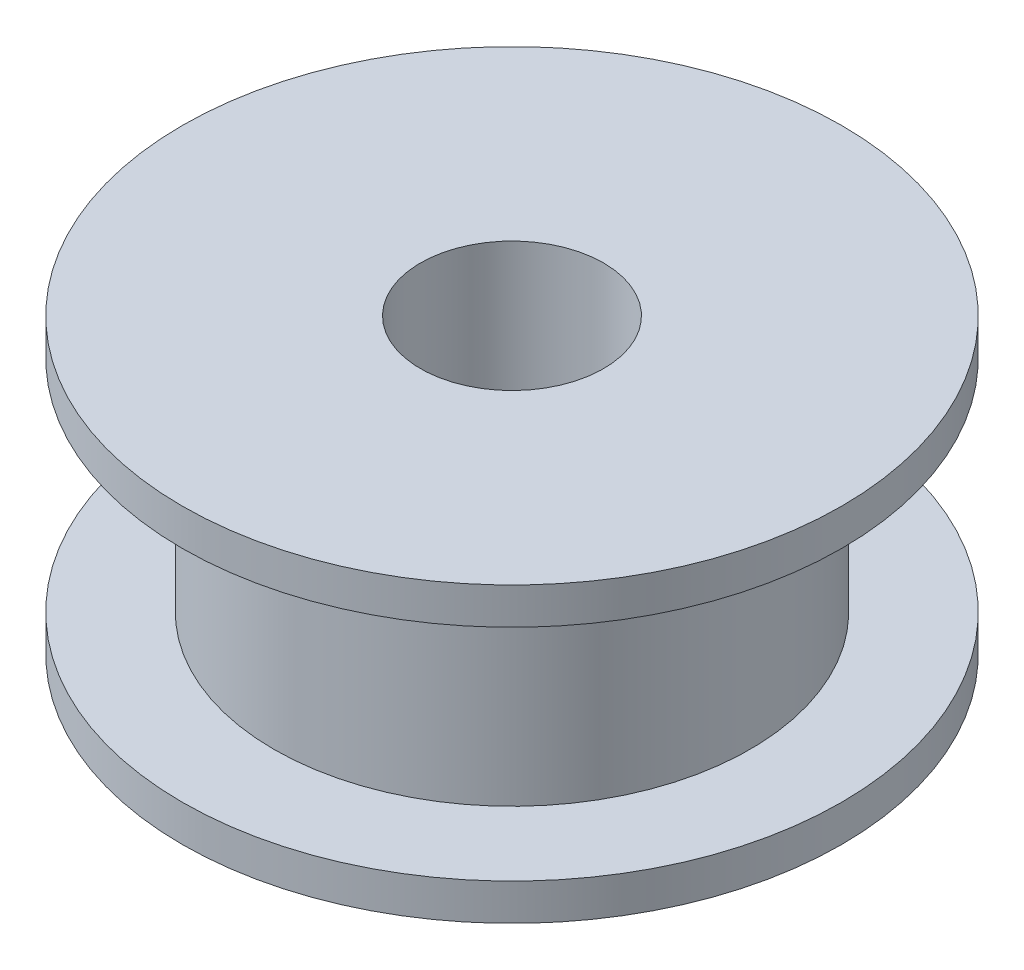
ISO-10303-21;
HEADER;
FILE_DESCRIPTION(('STEP AP214'),'2;1');
FILE_NAME('part.step','',(''),(''),'','','');
FILE_SCHEMA(('AUTOMOTIVE_DESIGN { 1 0 10303 214 1 1 1 1 }'));
ENDSEC;
DATA;
#1=APPLICATION_CONTEXT('core data for automotive mechanical design processes');
#2=APPLICATION_PROTOCOL_DEFINITION('international standard','automotive_design',2000,#1);
#3=PRODUCT_CONTEXT('',#1,'mechanical');
#4=PRODUCT('Part','Part','',(#3));
#5=PRODUCT_RELATED_PRODUCT_CATEGORY('part','',(#4));
#6=PRODUCT_DEFINITION_FORMATION('','',#4);
#7=PRODUCT_DEFINITION_CONTEXT('part definition',#1,'design');
#8=PRODUCT_DEFINITION('design','',#6,#7);
#9=PRODUCT_DEFINITION_SHAPE('','',#8);
#10=(LENGTH_UNIT() NAMED_UNIT(*) SI_UNIT(.MILLI.,.METRE.));
#11=(NAMED_UNIT(*) PLANE_ANGLE_UNIT() SI_UNIT($,.RADIAN.));
#12=(NAMED_UNIT(*) SI_UNIT($,.STERADIAN.) SOLID_ANGLE_UNIT());
#13=UNCERTAINTY_MEASURE_WITH_UNIT(LENGTH_MEASURE(1.E-05),#10,'distance_accuracy_value','');
#14=(GEOMETRIC_REPRESENTATION_CONTEXT(3) GLOBAL_UNCERTAINTY_ASSIGNED_CONTEXT((#13)) GLOBAL_UNIT_ASSIGNED_CONTEXT((#10,
#11,#12)) REPRESENTATION_CONTEXT('',''));
#15=CARTESIAN_POINT('',(0.,0.,0.));
#16=DIRECTION('',(0.,0.,1.));
#17=DIRECTION('',(1.,0.,0.));
#18=AXIS2_PLACEMENT_3D('',#15,#16,#17);
#19=CARTESIAN_POINT('',(9.,0.,0.));
#20=DIRECTION('',(0.,-1.,0.));
#21=DIRECTION('',(0.,0.,-1.));
#22=AXIS2_PLACEMENT_3D('',#19,#20,#21);
#23=PLANE('',#22);
#24=CARTESIAN_POINT('',(0.,0.,0.));
#25=DIRECTION('',(0.,-1.,0.));
#26=DIRECTION('',(0.,0.,-1.));
#27=AXIS2_PLACEMENT_3D('',#24,#25,#26);
#28=CIRCLE('',#27,9.);
#29=CARTESIAN_POINT('',(0.,0.,-9.));
#30=VERTEX_POINT('',#29);
#31=EDGE_CURVE('E72',#30,#30,#28,.T.);
#32=ORIENTED_EDGE('',*,*,#31,.T.);
#33=EDGE_LOOP('',(#32));
#34=FACE_BOUND('',#33,.T.);
#35=CARTESIAN_POINT('',(0.,0.,0.));
#36=DIRECTION('',(0.,-1.,0.));
#37=DIRECTION('',(0.,0.,-1.));
#38=AXIS2_PLACEMENT_3D('',#35,#36,#37);
#39=CIRCLE('',#38,2.5);
#40=CARTESIAN_POINT('',(0.,0.,-2.5));
#41=VERTEX_POINT('',#40);
#42=EDGE_CURVE('E10',#41,#41,#39,.T.);
#43=ORIENTED_EDGE('',*,*,#42,.F.);
#44=EDGE_LOOP('',(#43));
#45=FACE_BOUND('',#44,.T.);
#46=ADVANCED_FACE('F37',(#34,#45),#23,.T.);
#47=CARTESIAN_POINT('',(0.,0.,0.));
#48=DIRECTION('',(0.,-1.,0.));
#49=DIRECTION('',(0.,0.,-1.));
#50=AXIS2_PLACEMENT_3D('',#47,#48,#49);
#51=CYLINDRICAL_SURFACE('',#50,2.5);
#52=ORIENTED_EDGE('',*,*,#42,.T.);
#53=EDGE_LOOP('',(#52));
#54=FACE_BOUND('',#53,.T.);
#55=CARTESIAN_POINT('',(0.,8.,0.));
#56=DIRECTION('',(0.,-1.,0.));
#57=DIRECTION('',(0.,0.,-1.));
#58=AXIS2_PLACEMENT_3D('',#55,#56,#57);
#59=CIRCLE('',#58,2.5);
#60=CARTESIAN_POINT('',(0.,8.,-2.5));
#61=VERTEX_POINT('',#60);
#62=EDGE_CURVE('E44',#61,#61,#59,.T.);
#63=ORIENTED_EDGE('',*,*,#62,.F.);
#64=EDGE_LOOP('',(#63));
#65=FACE_BOUND('',#64,.T.);
#66=ADVANCED_FACE('F91',(#54,#65),#51,.F.);
#67=CARTESIAN_POINT('',(2.5,8.,0.));
#68=DIRECTION('',(0.,1.,0.));
#69=DIRECTION('',(0.,0.,1.));
#70=AXIS2_PLACEMENT_3D('',#67,#68,#69);
#71=PLANE('',#70);
#72=ORIENTED_EDGE('',*,*,#62,.T.);
#73=EDGE_LOOP('',(#72));
#74=FACE_BOUND('',#73,.T.);
#75=CARTESIAN_POINT('',(0.,8.,0.));
#76=DIRECTION('',(0.,-1.,0.));
#77=DIRECTION('',(0.,0.,-1.));
#78=AXIS2_PLACEMENT_3D('',#75,#76,#77);
#79=CIRCLE('',#78,9.);
#80=CARTESIAN_POINT('',(0.,8.,-9.));
#81=VERTEX_POINT('',#80);
#82=EDGE_CURVE('E49',#81,#81,#79,.T.);
#83=ORIENTED_EDGE('',*,*,#82,.F.);
#84=EDGE_LOOP('',(#83));
#85=FACE_BOUND('',#84,.T.);
#86=ADVANCED_FACE('F95',(#74,#85),#71,.T.);
#87=CARTESIAN_POINT('',(0.,0.,0.));
#88=DIRECTION('',(0.,-1.,0.));
#89=DIRECTION('',(0.,0.,-1.));
#90=AXIS2_PLACEMENT_3D('',#87,#88,#89);
#91=CYLINDRICAL_SURFACE('',#90,9.);
#92=ORIENTED_EDGE('',*,*,#82,.T.);
#93=EDGE_LOOP('',(#92));
#94=FACE_BOUND('',#93,.T.);
#95=CARTESIAN_POINT('',(0.,7.,0.));
#96=DIRECTION('',(0.,-1.,0.));
#97=DIRECTION('',(0.,0.,-1.));
#98=AXIS2_PLACEMENT_3D('',#95,#96,#97);
#99=CIRCLE('',#98,9.);
#100=CARTESIAN_POINT('',(0.,7.,-9.));
#101=VERTEX_POINT('',#100);
#102=EDGE_CURVE('E54',#101,#101,#99,.T.);
#103=ORIENTED_EDGE('',*,*,#102,.F.);
#104=EDGE_LOOP('',(#103));
#105=FACE_BOUND('',#104,.T.);
#106=ADVANCED_FACE('F99',(#94,#105),#91,.T.);
#107=CARTESIAN_POINT('',(9.,7.,0.));
#108=DIRECTION('',(0.,-1.,0.));
#109=DIRECTION('',(0.,0.,-1.));
#110=AXIS2_PLACEMENT_3D('',#107,#108,#109);
#111=PLANE('',#110);
#112=ORIENTED_EDGE('',*,*,#102,.T.);
#113=EDGE_LOOP('',(#112));
#114=FACE_BOUND('',#113,.T.);
#115=CARTESIAN_POINT('',(0.,7.,0.));
#116=DIRECTION('',(0.,-1.,0.));
#117=DIRECTION('',(0.,0.,-1.));
#118=AXIS2_PLACEMENT_3D('',#115,#116,#117);
#119=CIRCLE('',#118,6.5);
#120=CARTESIAN_POINT('',(0.,7.,-6.5));
#121=VERTEX_POINT('',#120);
#122=EDGE_CURVE('E60',#121,#121,#119,.T.);
#123=ORIENTED_EDGE('',*,*,#122,.F.);
#124=EDGE_LOOP('',(#123));
#125=FACE_BOUND('',#124,.T.);
#126=ADVANCED_FACE('F105',(#114,#125),#111,.T.);
#127=CARTESIAN_POINT('',(0.,0.,0.));
#128=DIRECTION('',(0.,-1.,0.));
#129=DIRECTION('',(0.,0.,-1.));
#130=AXIS2_PLACEMENT_3D('',#127,#128,#129);
#131=CYLINDRICAL_SURFACE('',#130,6.5);
#132=ORIENTED_EDGE('',*,*,#122,.T.);
#133=EDGE_LOOP('',(#132));
#134=FACE_BOUND('',#133,.T.);
#135=CARTESIAN_POINT('',(0.,1.,0.));
#136=DIRECTION('',(0.,-1.,0.));
#137=DIRECTION('',(0.,0.,-1.));
#138=AXIS2_PLACEMENT_3D('',#135,#136,#137);
#139=CIRCLE('',#138,6.5);
#140=CARTESIAN_POINT('',(0.,1.,-6.5));
#141=VERTEX_POINT('',#140);
#142=EDGE_CURVE('E64',#141,#141,#139,.T.);
#143=ORIENTED_EDGE('',*,*,#142,.F.);
#144=EDGE_LOOP('',(#143));
#145=FACE_BOUND('',#144,.T.);
#146=ADVANCED_FACE('F87',(#134,#145),#131,.T.);
#147=CARTESIAN_POINT('',(6.5,1.,0.));
#148=DIRECTION('',(0.,1.,0.));
#149=DIRECTION('',(0.,0.,1.));
#150=AXIS2_PLACEMENT_3D('',#147,#148,#149);
#151=PLANE('',#150);
#152=ORIENTED_EDGE('',*,*,#142,.T.);
#153=EDGE_LOOP('',(#152));
#154=FACE_BOUND('',#153,.T.);
#155=CARTESIAN_POINT('',(0.,1.,0.));
#156=DIRECTION('',(0.,-1.,0.));
#157=DIRECTION('',(0.,0.,-1.));
#158=AXIS2_PLACEMENT_3D('',#155,#156,#157);
#159=CIRCLE('',#158,9.);
#160=CARTESIAN_POINT('',(0.,1.,-9.));
#161=VERTEX_POINT('',#160);
#162=EDGE_CURVE('E68',#161,#161,#159,.T.);
#163=ORIENTED_EDGE('',*,*,#162,.F.);
#164=EDGE_LOOP('',(#163));
#165=FACE_BOUND('',#164,.T.);
#166=ADVANCED_FACE('F81',(#154,#165),#151,.T.);
#167=CARTESIAN_POINT('',(0.,0.,0.));
#168=DIRECTION('',(0.,-1.,0.));
#169=DIRECTION('',(0.,0.,-1.));
#170=AXIS2_PLACEMENT_3D('',#167,#168,#169);
#171=CYLINDRICAL_SURFACE('',#170,9.);
#172=ORIENTED_EDGE('',*,*,#162,.T.);
#173=EDGE_LOOP('',(#172));
#174=FACE_BOUND('',#173,.T.);
#175=ORIENTED_EDGE('',*,*,#31,.F.);
#176=EDGE_LOOP('',(#175));
#177=FACE_BOUND('',#176,.T.);
#178=ADVANCED_FACE('F79',(#174,#177),#171,.T.);
#179=CLOSED_SHELL('',(#46,#66,#86,#106,#126,#146,#166,#178));
#180=MANIFOLD_SOLID_BREP('B2',#179);
#181=ADVANCED_BREP_SHAPE_REPRESENTATION('',(#18,#180),#14);
#182=SHAPE_DEFINITION_REPRESENTATION(#9,#181);
ENDSEC;
END-ISO-10303-21;
